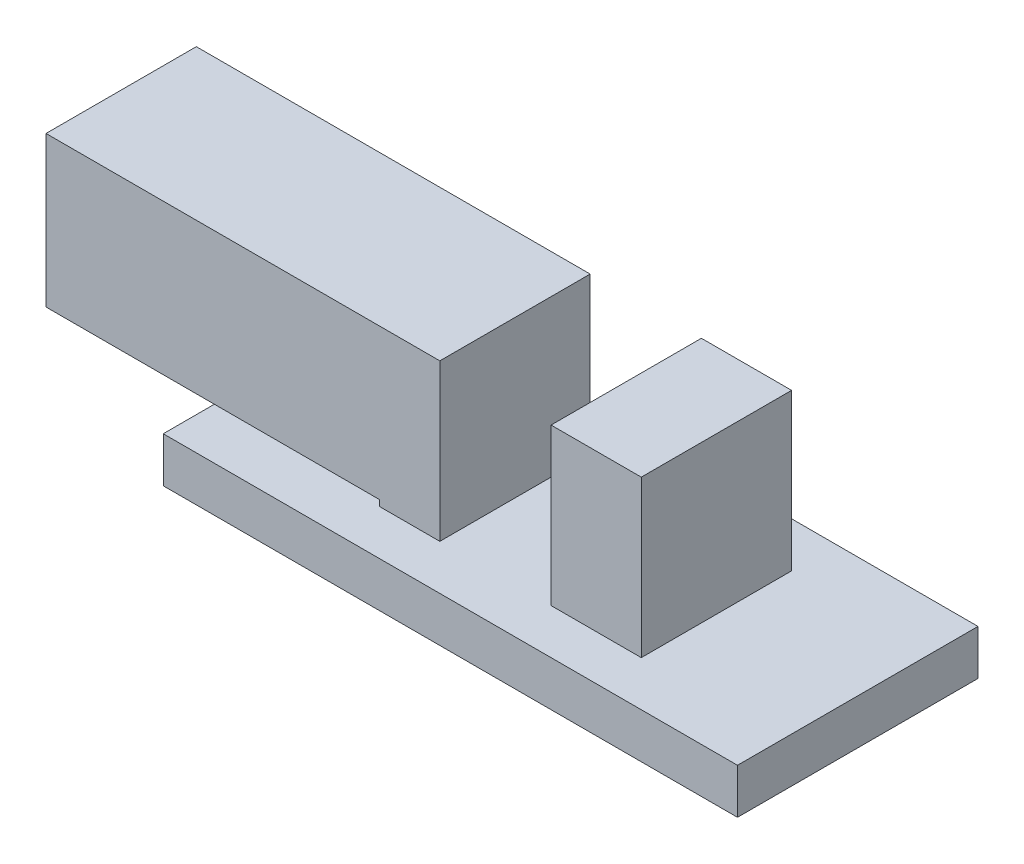
ISO-10303-21;
HEADER;
FILE_DESCRIPTION(('STEP AP214'),'2;1');
FILE_NAME('part.step','',(''),(''),'','','');
FILE_SCHEMA(('AUTOMOTIVE_DESIGN { 1 0 10303 214 1 1 1 1 }'));
ENDSEC;
DATA;
#1=APPLICATION_CONTEXT('core data for automotive mechanical design processes');
#2=APPLICATION_PROTOCOL_DEFINITION('international standard','automotive_design',2000,#1);
#3=PRODUCT_CONTEXT('',#1,'mechanical');
#4=PRODUCT('Part','Part','',(#3));
#5=PRODUCT_RELATED_PRODUCT_CATEGORY('part','',(#4));
#6=PRODUCT_DEFINITION_FORMATION('','',#4);
#7=PRODUCT_DEFINITION_CONTEXT('part definition',#1,'design');
#8=PRODUCT_DEFINITION('design','',#6,#7);
#9=PRODUCT_DEFINITION_SHAPE('','',#8);
#10=(LENGTH_UNIT() NAMED_UNIT(*) SI_UNIT(.MILLI.,.METRE.));
#11=(NAMED_UNIT(*) PLANE_ANGLE_UNIT() SI_UNIT($,.RADIAN.));
#12=(NAMED_UNIT(*) SI_UNIT($,.STERADIAN.) SOLID_ANGLE_UNIT());
#13=UNCERTAINTY_MEASURE_WITH_UNIT(LENGTH_MEASURE(1.E-05),#10,'distance_accuracy_value','');
#14=(GEOMETRIC_REPRESENTATION_CONTEXT(3) GLOBAL_UNCERTAINTY_ASSIGNED_CONTEXT((#13)) GLOBAL_UNIT_ASSIGNED_CONTEXT((#10,
#11,#12)) REPRESENTATION_CONTEXT('',''));
#15=CARTESIAN_POINT('',(0.,0.,0.));
#16=DIRECTION('',(0.,0.,1.));
#17=DIRECTION('',(1.,0.,0.));
#18=AXIS2_PLACEMENT_3D('',#15,#16,#17);
#19=CARTESIAN_POINT('',(0.,15.,0.));
#20=DIRECTION('',(0.,1.,0.));
#21=DIRECTION('',(0.,0.,1.));
#22=AXIS2_PLACEMENT_3D('',#19,#20,#21);
#23=PLANE('',#22);
#24=DIRECTION('',(0.,0.,-1.));
#25=VECTOR('',#24,1.);
#26=CARTESIAN_POINT('',(95.5,15.,-40.));
#27=LINE('',#26,#25);
#28=CARTESIAN_POINT('',(95.5,15.,40.));
#29=VERTEX_POINT('',#28);
#30=CARTESIAN_POINT('',(95.5,15.,-40.));
#31=VERTEX_POINT('',#30);
#32=EDGE_CURVE('E222',#29,#31,#27,.T.);
#33=ORIENTED_EDGE('',*,*,#32,.T.);
#34=DIRECTION('',(-1.,0.,0.));
#35=VECTOR('',#34,1.);
#36=CARTESIAN_POINT('',(-95.5,15.,-40.));
#37=LINE('',#36,#35);
#38=CARTESIAN_POINT('',(-95.5,15.,-40.));
#39=VERTEX_POINT('',#38);
#40=EDGE_CURVE('E225',#31,#39,#37,.T.);
#41=ORIENTED_EDGE('',*,*,#40,.T.);
#42=DIRECTION('',(0.,0.,1.));
#43=VECTOR('',#42,1.);
#44=CARTESIAN_POINT('',(-95.5,15.,-40.));
#45=LINE('',#44,#43);
#46=CARTESIAN_POINT('',(-95.5,15.,40.));
#47=VERTEX_POINT('',#46);
#48=EDGE_CURVE('E228',#39,#47,#45,.T.);
#49=ORIENTED_EDGE('',*,*,#48,.T.);
#50=DIRECTION('',(1.,0.,0.));
#51=VECTOR('',#50,1.);
#52=CARTESIAN_POINT('',(-95.5,15.,40.));
#53=LINE('',#52,#51);
#54=EDGE_CURVE('E230',#47,#29,#53,.T.);
#55=ORIENTED_EDGE('',*,*,#54,.T.);
#56=EDGE_LOOP('',(#33,#41,#49,#55));
#57=FACE_BOUND('',#56,.T.);
#58=DIRECTION('',(-1.,0.,0.));
#59=VECTOR('',#58,1.);
#60=CARTESIAN_POINT('',(-38.5,15.,-25.));
#61=LINE('',#60,#59);
#62=CARTESIAN_POINT('',(-18.5,15.,-25.));
#63=VERTEX_POINT('',#62);
#64=CARTESIAN_POINT('',(-38.5,15.,-25.));
#65=VERTEX_POINT('',#64);
#66=EDGE_CURVE('E208',#63,#65,#61,.T.);
#67=ORIENTED_EDGE('',*,*,#66,.F.);
#68=DIRECTION('',(0.,0.,-1.));
#69=VECTOR('',#68,1.);
#70=CARTESIAN_POINT('',(-18.5,15.,-25.));
#71=LINE('',#70,#69);
#72=CARTESIAN_POINT('',(-18.5,15.,25.));
#73=VERTEX_POINT('',#72);
#74=EDGE_CURVE('E190',#73,#63,#71,.T.);
#75=ORIENTED_EDGE('',*,*,#74,.F.);
#76=DIRECTION('',(1.,0.,0.));
#77=VECTOR('',#76,1.);
#78=CARTESIAN_POINT('',(-38.5,15.,25.));
#79=LINE('',#78,#77);
#80=CARTESIAN_POINT('',(-38.5,15.,25.));
#81=VERTEX_POINT('',#80);
#82=EDGE_CURVE('E202',#81,#73,#79,.T.);
#83=ORIENTED_EDGE('',*,*,#82,.F.);
#84=DIRECTION('',(0.,0.,1.));
#85=VECTOR('',#84,1.);
#86=CARTESIAN_POINT('',(-38.5,15.,-25.));
#87=LINE('',#86,#85);
#88=EDGE_CURVE('E211',#65,#81,#87,.T.);
#89=ORIENTED_EDGE('',*,*,#88,.F.);
#90=EDGE_LOOP('',(#67,#75,#83,#89));
#91=FACE_BOUND('',#90,.T.);
#92=DIRECTION('',(-1.,0.,0.));
#93=VECTOR('',#92,1.);
#94=CARTESIAN_POINT('',(18.5,15.,-25.));
#95=LINE('',#94,#93);
#96=CARTESIAN_POINT('',(48.5,15.,-25.));
#97=VERTEX_POINT('',#96);
#98=CARTESIAN_POINT('',(18.5,15.,-25.));
#99=VERTEX_POINT('',#98);
#100=EDGE_CURVE('E185',#97,#99,#95,.T.);
#101=ORIENTED_EDGE('',*,*,#100,.F.);
#102=DIRECTION('',(0.,0.,-1.));
#103=VECTOR('',#102,1.);
#104=CARTESIAN_POINT('',(48.5,15.,-25.));
#105=LINE('',#104,#103);
#106=CARTESIAN_POINT('',(48.5,15.,25.));
#107=VERTEX_POINT('',#106);
#108=EDGE_CURVE('E187',#107,#97,#105,.T.);
#109=ORIENTED_EDGE('',*,*,#108,.F.);
#110=DIRECTION('',(1.,0.,0.));
#111=VECTOR('',#110,1.);
#112=CARTESIAN_POINT('',(18.5,15.,25.));
#113=LINE('',#112,#111);
#114=CARTESIAN_POINT('',(18.5,15.,25.));
#115=VERTEX_POINT('',#114);
#116=EDGE_CURVE('E180',#115,#107,#113,.T.);
#117=ORIENTED_EDGE('',*,*,#116,.F.);
#118=DIRECTION('',(0.,0.,1.));
#119=VECTOR('',#118,1.);
#120=CARTESIAN_POINT('',(18.5,15.,-25.));
#121=LINE('',#120,#119);
#122=EDGE_CURVE('E182',#99,#115,#121,.T.);
#123=ORIENTED_EDGE('',*,*,#122,.F.);
#124=EDGE_LOOP('',(#101,#109,#117,#123));
#125=FACE_BOUND('',#124,.T.);
#126=ADVANCED_FACE('F39',(#57,#91,#125),#23,.T.);
#127=CARTESIAN_POINT('',(95.5,15.,-40.));
#128=DIRECTION('',(-1.,0.,0.));
#129=DIRECTION('',(0.,0.,1.));
#130=AXIS2_PLACEMENT_3D('',#127,#128,#129);
#131=PLANE('',#130);
#132=DIRECTION('',(0.,0.,-1.));
#133=VECTOR('',#132,1.);
#134=CARTESIAN_POINT('',(95.5,0.,-40.));
#135=LINE('',#134,#133);
#136=CARTESIAN_POINT('',(95.5,0.,40.));
#137=VERTEX_POINT('',#136);
#138=CARTESIAN_POINT('',(95.5,0.,-40.));
#139=VERTEX_POINT('',#138);
#140=EDGE_CURVE('E221',#137,#139,#135,.T.);
#141=ORIENTED_EDGE('',*,*,#140,.T.);
#142=DIRECTION('',(0.,-1.,0.));
#143=VECTOR('',#142,1.);
#144=CARTESIAN_POINT('',(95.5,15.,-40.));
#145=LINE('',#144,#143);
#146=EDGE_CURVE('E11',#31,#139,#145,.T.);
#147=ORIENTED_EDGE('',*,*,#146,.F.);
#148=ORIENTED_EDGE('',*,*,#32,.F.);
#149=DIRECTION('',(0.,-1.,0.));
#150=VECTOR('',#149,1.);
#151=CARTESIAN_POINT('',(95.5,15.,40.));
#152=LINE('',#151,#150);
#153=EDGE_CURVE('E232',#29,#137,#152,.T.);
#154=ORIENTED_EDGE('',*,*,#153,.T.);
#155=EDGE_LOOP('',(#141,#147,#148,#154));
#156=FACE_BOUND('',#155,.T.);
#157=ADVANCED_FACE('F41',(#156),#131,.F.);
#158=CARTESIAN_POINT('',(-95.5,15.,-40.));
#159=DIRECTION('',(0.,0.,1.));
#160=DIRECTION('',(1.,0.,0.));
#161=AXIS2_PLACEMENT_3D('',#158,#159,#160);
#162=PLANE('',#161);
#163=DIRECTION('',(-1.,0.,0.));
#164=VECTOR('',#163,1.);
#165=CARTESIAN_POINT('',(-95.5,0.,-40.));
#166=LINE('',#165,#164);
#167=CARTESIAN_POINT('',(-95.5,0.,-40.));
#168=VERTEX_POINT('',#167);
#169=EDGE_CURVE('E235',#139,#168,#166,.T.);
#170=ORIENTED_EDGE('',*,*,#169,.T.);
#171=DIRECTION('',(0.,-1.,0.));
#172=VECTOR('',#171,1.);
#173=CARTESIAN_POINT('',(-95.5,15.,-40.));
#174=LINE('',#173,#172);
#175=EDGE_CURVE('E47',#39,#168,#174,.T.);
#176=ORIENTED_EDGE('',*,*,#175,.F.);
#177=ORIENTED_EDGE('',*,*,#40,.F.);
#178=ORIENTED_EDGE('',*,*,#146,.T.);
#179=EDGE_LOOP('',(#170,#176,#177,#178));
#180=FACE_BOUND('',#179,.T.);
#181=ADVANCED_FACE('F265',(#180),#162,.F.);
#182=CARTESIAN_POINT('',(-95.5,15.,-40.));
#183=DIRECTION('',(1.,0.,0.));
#184=DIRECTION('',(0.,0.,-1.));
#185=AXIS2_PLACEMENT_3D('',#182,#183,#184);
#186=PLANE('',#185);
#187=DIRECTION('',(0.,0.,1.));
#188=VECTOR('',#187,1.);
#189=CARTESIAN_POINT('',(-95.5,0.,-40.));
#190=LINE('',#189,#188);
#191=CARTESIAN_POINT('',(-95.5,0.,40.));
#192=VERTEX_POINT('',#191);
#193=EDGE_CURVE('E237',#168,#192,#190,.T.);
#194=ORIENTED_EDGE('',*,*,#193,.T.);
#195=DIRECTION('',(0.,-1.,0.));
#196=VECTOR('',#195,1.);
#197=CARTESIAN_POINT('',(-95.5,15.,40.));
#198=LINE('',#197,#196);
#199=EDGE_CURVE('E242',#47,#192,#198,.T.);
#200=ORIENTED_EDGE('',*,*,#199,.F.);
#201=ORIENTED_EDGE('',*,*,#48,.F.);
#202=ORIENTED_EDGE('',*,*,#175,.T.);
#203=EDGE_LOOP('',(#194,#200,#201,#202));
#204=FACE_BOUND('',#203,.T.);
#205=ADVANCED_FACE('F249',(#204),#186,.F.);
#206=CARTESIAN_POINT('',(-95.5,15.,40.));
#207=DIRECTION('',(0.,0.,-1.));
#208=DIRECTION('',(-1.,0.,0.));
#209=AXIS2_PLACEMENT_3D('',#206,#207,#208);
#210=PLANE('',#209);
#211=DIRECTION('',(1.,0.,0.));
#212=VECTOR('',#211,1.);
#213=CARTESIAN_POINT('',(-95.5,0.,40.));
#214=LINE('',#213,#212);
#215=EDGE_CURVE('E226',#192,#137,#214,.T.);
#216=ORIENTED_EDGE('',*,*,#215,.T.);
#217=ORIENTED_EDGE('',*,*,#153,.F.);
#218=ORIENTED_EDGE('',*,*,#54,.F.);
#219=ORIENTED_EDGE('',*,*,#199,.T.);
#220=EDGE_LOOP('',(#216,#217,#218,#219));
#221=FACE_BOUND('',#220,.T.);
#222=ADVANCED_FACE('F258',(#221),#210,.F.);
#223=CARTESIAN_POINT('',(0.,0.,0.));
#224=DIRECTION('',(0.,1.,0.));
#225=DIRECTION('',(0.,0.,1.));
#226=AXIS2_PLACEMENT_3D('',#223,#224,#225);
#227=PLANE('',#226);
#228=ORIENTED_EDGE('',*,*,#140,.F.);
#229=ORIENTED_EDGE('',*,*,#215,.F.);
#230=ORIENTED_EDGE('',*,*,#193,.F.);
#231=ORIENTED_EDGE('',*,*,#169,.F.);
#232=EDGE_LOOP('',(#228,#229,#230,#231));
#233=FACE_BOUND('',#232,.T.);
#234=ADVANCED_FACE('F255',(#233),#227,.F.);
#235=CARTESIAN_POINT('',(-18.5,67.,-25.));
#236=DIRECTION('',(-1.,0.,0.));
#237=DIRECTION('',(0.,0.,1.));
#238=AXIS2_PLACEMENT_3D('',#235,#236,#237);
#239=PLANE('',#238);
#240=ORIENTED_EDGE('',*,*,#74,.T.);
#241=DIRECTION('',(0.,-1.,0.));
#242=VECTOR('',#241,1.);
#243=CARTESIAN_POINT('',(-18.5,67.,-25.));
#244=LINE('',#243,#242);
#245=CARTESIAN_POINT('',(-18.5,67.,-25.));
#246=VERTEX_POINT('',#245);
#247=EDGE_CURVE('E219',#246,#63,#244,.T.);
#248=ORIENTED_EDGE('',*,*,#247,.F.);
#249=DIRECTION('',(0.,0.,-1.));
#250=VECTOR('',#249,1.);
#251=CARTESIAN_POINT('',(-18.5,67.,-25.));
#252=LINE('',#251,#250);
#253=CARTESIAN_POINT('',(-18.5,67.,25.));
#254=VERTEX_POINT('',#253);
#255=EDGE_CURVE('E198',#254,#246,#252,.T.);
#256=ORIENTED_EDGE('',*,*,#255,.F.);
#257=DIRECTION('',(0.,-1.,0.));
#258=VECTOR('',#257,1.);
#259=CARTESIAN_POINT('',(-18.5,67.,25.));
#260=LINE('',#259,#258);
#261=EDGE_CURVE('E205',#254,#73,#260,.T.);
#262=ORIENTED_EDGE('',*,*,#261,.T.);
#263=EDGE_LOOP('',(#240,#248,#256,#262));
#264=FACE_BOUND('',#263,.T.);
#265=ADVANCED_FACE('F280',(#264),#239,.F.);
#266=CARTESIAN_POINT('',(-38.5,67.,-25.));
#267=DIRECTION('',(0.,0.,1.));
#268=DIRECTION('',(1.,0.,0.));
#269=AXIS2_PLACEMENT_3D('',#266,#267,#268);
#270=PLANE('',#269);
#271=ORIENTED_EDGE('',*,*,#66,.T.);
#272=DIRECTION('',(0.,-1.,0.));
#273=VECTOR('',#272,1.);
#274=CARTESIAN_POINT('',(-38.5,67.,-25.));
#275=LINE('',#274,#273);
#276=CARTESIAN_POINT('',(-38.5,17.,-25.));
#277=VERTEX_POINT('',#276);
#278=EDGE_CURVE('E217',#277,#65,#275,.T.);
#279=ORIENTED_EDGE('',*,*,#278,.F.);
#280=DIRECTION('',(1.,0.,0.));
#281=VECTOR('',#280,1.);
#282=CARTESIAN_POINT('',(-149.5,17.,-25.));
#283=LINE('',#282,#281);
#284=CARTESIAN_POINT('',(-149.5,17.,-25.));
#285=VERTEX_POINT('',#284);
#286=EDGE_CURVE('E148',#285,#277,#283,.T.);
#287=ORIENTED_EDGE('',*,*,#286,.F.);
#288=DIRECTION('',(0.,1.,0.));
#289=VECTOR('',#288,1.);
#290=CARTESIAN_POINT('',(-149.5,67.,-25.));
#291=LINE('',#290,#289);
#292=CARTESIAN_POINT('',(-149.5,67.,-25.));
#293=VERTEX_POINT('',#292);
#294=EDGE_CURVE('E159',#285,#293,#291,.T.);
#295=ORIENTED_EDGE('',*,*,#294,.T.);
#296=DIRECTION('',(-1.,0.,0.));
#297=VECTOR('',#296,1.);
#298=CARTESIAN_POINT('',(-38.5,67.,-25.));
#299=LINE('',#298,#297);
#300=EDGE_CURVE('E201',#246,#293,#299,.T.);
#301=ORIENTED_EDGE('',*,*,#300,.F.);
#302=ORIENTED_EDGE('',*,*,#247,.T.);
#303=EDGE_LOOP('',(#271,#279,#287,#295,#301,#302));
#304=FACE_BOUND('',#303,.T.);
#305=ADVANCED_FACE('F306',(#304),#270,.F.);
#306=CARTESIAN_POINT('',(-38.5,67.,-25.));
#307=DIRECTION('',(1.,0.,0.));
#308=DIRECTION('',(0.,0.,-1.));
#309=AXIS2_PLACEMENT_3D('',#306,#307,#308);
#310=PLANE('',#309);
#311=DIRECTION('',(0.,-1.,0.));
#312=VECTOR('',#311,1.);
#313=CARTESIAN_POINT('',(-38.5,67.,25.));
#314=LINE('',#313,#312);
#315=CARTESIAN_POINT('',(-38.5,17.,25.));
#316=VERTEX_POINT('',#315);
#317=EDGE_CURVE('E62',#316,#81,#314,.T.);
#318=ORIENTED_EDGE('',*,*,#317,.F.);
#319=DIRECTION('',(0.,0.,-1.));
#320=VECTOR('',#319,1.);
#321=CARTESIAN_POINT('',(-38.5,17.,25.));
#322=LINE('',#321,#320);
#323=EDGE_CURVE('E146',#316,#277,#322,.T.);
#324=ORIENTED_EDGE('',*,*,#323,.T.);
#325=ORIENTED_EDGE('',*,*,#278,.T.);
#326=ORIENTED_EDGE('',*,*,#88,.T.);
#327=EDGE_LOOP('',(#318,#324,#325,#326));
#328=FACE_BOUND('',#327,.T.);
#329=ADVANCED_FACE('F317',(#328),#310,.F.);
#330=CARTESIAN_POINT('',(-38.5,67.,25.));
#331=DIRECTION('',(0.,0.,-1.));
#332=DIRECTION('',(-1.,0.,0.));
#333=AXIS2_PLACEMENT_3D('',#330,#331,#332);
#334=PLANE('',#333);
#335=ORIENTED_EDGE('',*,*,#82,.T.);
#336=ORIENTED_EDGE('',*,*,#261,.F.);
#337=DIRECTION('',(1.,0.,0.));
#338=VECTOR('',#337,1.);
#339=CARTESIAN_POINT('',(-38.5,67.,25.));
#340=LINE('',#339,#338);
#341=CARTESIAN_POINT('',(-149.5,67.,25.));
#342=VERTEX_POINT('',#341);
#343=EDGE_CURVE('E163',#342,#254,#340,.T.);
#344=ORIENTED_EDGE('',*,*,#343,.F.);
#345=DIRECTION('',(0.,-1.,0.));
#346=VECTOR('',#345,1.);
#347=CARTESIAN_POINT('',(-149.5,67.,25.));
#348=LINE('',#347,#346);
#349=CARTESIAN_POINT('',(-149.5,17.,25.));
#350=VERTEX_POINT('',#349);
#351=EDGE_CURVE('E156',#342,#350,#348,.T.);
#352=ORIENTED_EDGE('',*,*,#351,.T.);
#353=DIRECTION('',(1.,0.,0.));
#354=VECTOR('',#353,1.);
#355=CARTESIAN_POINT('',(-149.5,17.,25.));
#356=LINE('',#355,#354);
#357=EDGE_CURVE('E141',#350,#316,#356,.T.);
#358=ORIENTED_EDGE('',*,*,#357,.T.);
#359=ORIENTED_EDGE('',*,*,#317,.T.);
#360=EDGE_LOOP('',(#335,#336,#344,#352,#358,#359));
#361=FACE_BOUND('',#360,.T.);
#362=ADVANCED_FACE('F161',(#361),#334,.F.);
#363=CARTESIAN_POINT('',(0.,67.,0.));
#364=DIRECTION('',(0.,1.,0.));
#365=DIRECTION('',(0.,0.,1.));
#366=AXIS2_PLACEMENT_3D('',#363,#364,#365);
#367=PLANE('',#366);
#368=ORIENTED_EDGE('',*,*,#255,.T.);
#369=ORIENTED_EDGE('',*,*,#300,.T.);
#370=DIRECTION('',(0.,0.,1.));
#371=VECTOR('',#370,1.);
#372=CARTESIAN_POINT('',(-149.5,67.,25.));
#373=LINE('',#372,#371);
#374=EDGE_CURVE('E149',#293,#342,#373,.T.);
#375=ORIENTED_EDGE('',*,*,#374,.T.);
#376=ORIENTED_EDGE('',*,*,#343,.T.);
#377=EDGE_LOOP('',(#368,#369,#375,#376));
#378=FACE_BOUND('',#377,.T.);
#379=ADVANCED_FACE('F338',(#378),#367,.T.);
#380=CARTESIAN_POINT('',(48.5,67.,-25.));
#381=DIRECTION('',(-1.,0.,0.));
#382=DIRECTION('',(0.,0.,1.));
#383=AXIS2_PLACEMENT_3D('',#380,#381,#382);
#384=PLANE('',#383);
#385=ORIENTED_EDGE('',*,*,#108,.T.);
#386=DIRECTION('',(0.,-1.,0.));
#387=VECTOR('',#386,1.);
#388=CARTESIAN_POINT('',(48.5,67.,-25.));
#389=LINE('',#388,#387);
#390=CARTESIAN_POINT('',(48.5,67.,-25.));
#391=VERTEX_POINT('',#390);
#392=EDGE_CURVE('E169',#391,#97,#389,.T.);
#393=ORIENTED_EDGE('',*,*,#392,.F.);
#394=DIRECTION('',(0.,0.,-1.));
#395=VECTOR('',#394,1.);
#396=CARTESIAN_POINT('',(48.5,67.,-25.));
#397=LINE('',#396,#395);
#398=CARTESIAN_POINT('',(48.5,67.,25.));
#399=VERTEX_POINT('',#398);
#400=EDGE_CURVE('E183',#399,#391,#397,.T.);
#401=ORIENTED_EDGE('',*,*,#400,.F.);
#402=DIRECTION('',(0.,-1.,0.));
#403=VECTOR('',#402,1.);
#404=CARTESIAN_POINT('',(48.5,67.,25.));
#405=LINE('',#404,#403);
#406=EDGE_CURVE('E176',#399,#107,#405,.T.);
#407=ORIENTED_EDGE('',*,*,#406,.T.);
#408=EDGE_LOOP('',(#385,#393,#401,#407));
#409=FACE_BOUND('',#408,.T.);
#410=ADVANCED_FACE('F349',(#409),#384,.F.);
#411=CARTESIAN_POINT('',(18.5,67.,-25.));
#412=DIRECTION('',(0.,0.,1.));
#413=DIRECTION('',(1.,0.,0.));
#414=AXIS2_PLACEMENT_3D('',#411,#412,#413);
#415=PLANE('',#414);
#416=ORIENTED_EDGE('',*,*,#100,.T.);
#417=DIRECTION('',(0.,-1.,0.));
#418=VECTOR('',#417,1.);
#419=CARTESIAN_POINT('',(18.5,67.,-25.));
#420=LINE('',#419,#418);
#421=CARTESIAN_POINT('',(18.5,67.,-25.));
#422=VERTEX_POINT('',#421);
#423=EDGE_CURVE('E172',#422,#99,#420,.T.);
#424=ORIENTED_EDGE('',*,*,#423,.F.);
#425=DIRECTION('',(-1.,0.,0.));
#426=VECTOR('',#425,1.);
#427=CARTESIAN_POINT('',(18.5,67.,-25.));
#428=LINE('',#427,#426);
#429=EDGE_CURVE('E194',#391,#422,#428,.T.);
#430=ORIENTED_EDGE('',*,*,#429,.F.);
#431=ORIENTED_EDGE('',*,*,#392,.T.);
#432=EDGE_LOOP('',(#416,#424,#430,#431));
#433=FACE_BOUND('',#432,.T.);
#434=ADVANCED_FACE('F360',(#433),#415,.F.);
#435=CARTESIAN_POINT('',(18.5,67.,-25.));
#436=DIRECTION('',(1.,0.,0.));
#437=DIRECTION('',(0.,0.,-1.));
#438=AXIS2_PLACEMENT_3D('',#435,#436,#437);
#439=PLANE('',#438);
#440=ORIENTED_EDGE('',*,*,#122,.T.);
#441=DIRECTION('',(0.,-1.,0.));
#442=VECTOR('',#441,1.);
#443=CARTESIAN_POINT('',(18.5,67.,25.));
#444=LINE('',#443,#442);
#445=CARTESIAN_POINT('',(18.5,67.,25.));
#446=VERTEX_POINT('',#445);
#447=EDGE_CURVE('E54',#446,#115,#444,.T.);
#448=ORIENTED_EDGE('',*,*,#447,.F.);
#449=DIRECTION('',(0.,0.,1.));
#450=VECTOR('',#449,1.);
#451=CARTESIAN_POINT('',(18.5,67.,-25.));
#452=LINE('',#451,#450);
#453=EDGE_CURVE('E192',#422,#446,#452,.T.);
#454=ORIENTED_EDGE('',*,*,#453,.F.);
#455=ORIENTED_EDGE('',*,*,#423,.T.);
#456=EDGE_LOOP('',(#440,#448,#454,#455));
#457=FACE_BOUND('',#456,.T.);
#458=ADVANCED_FACE('F370',(#457),#439,.F.);
#459=CARTESIAN_POINT('',(18.5,67.,25.));
#460=DIRECTION('',(0.,0.,-1.));
#461=DIRECTION('',(-1.,0.,0.));
#462=AXIS2_PLACEMENT_3D('',#459,#460,#461);
#463=PLANE('',#462);
#464=ORIENTED_EDGE('',*,*,#116,.T.);
#465=ORIENTED_EDGE('',*,*,#406,.F.);
#466=DIRECTION('',(1.,0.,0.));
#467=VECTOR('',#466,1.);
#468=CARTESIAN_POINT('',(18.5,67.,25.));
#469=LINE('',#468,#467);
#470=EDGE_CURVE('E179',#446,#399,#469,.T.);
#471=ORIENTED_EDGE('',*,*,#470,.F.);
#472=ORIENTED_EDGE('',*,*,#447,.T.);
#473=EDGE_LOOP('',(#464,#465,#471,#472));
#474=FACE_BOUND('',#473,.T.);
#475=ADVANCED_FACE('F380',(#474),#463,.F.);
#476=CARTESIAN_POINT('',(0.,67.,0.));
#477=DIRECTION('',(0.,1.,0.));
#478=DIRECTION('',(0.,0.,1.));
#479=AXIS2_PLACEMENT_3D('',#476,#477,#478);
#480=PLANE('',#479);
#481=ORIENTED_EDGE('',*,*,#400,.T.);
#482=ORIENTED_EDGE('',*,*,#429,.T.);
#483=ORIENTED_EDGE('',*,*,#453,.T.);
#484=ORIENTED_EDGE('',*,*,#470,.T.);
#485=EDGE_LOOP('',(#481,#482,#483,#484));
#486=FACE_BOUND('',#485,.T.);
#487=ADVANCED_FACE('F389',(#486),#480,.T.);
#488=CARTESIAN_POINT('',(-149.5,17.,25.));
#489=DIRECTION('',(0.,-1.,0.));
#490=DIRECTION('',(0.,0.,-1.));
#491=AXIS2_PLACEMENT_3D('',#488,#489,#490);
#492=PLANE('',#491);
#493=ORIENTED_EDGE('',*,*,#323,.F.);
#494=ORIENTED_EDGE('',*,*,#357,.F.);
#495=DIRECTION('',(0.,0.,-1.));
#496=VECTOR('',#495,1.);
#497=CARTESIAN_POINT('',(-149.5,17.,25.));
#498=LINE('',#497,#496);
#499=EDGE_CURVE('E144',#350,#285,#498,.T.);
#500=ORIENTED_EDGE('',*,*,#499,.T.);
#501=ORIENTED_EDGE('',*,*,#286,.T.);
#502=EDGE_LOOP('',(#493,#494,#500,#501));
#503=FACE_BOUND('',#502,.T.);
#504=ADVANCED_FACE('F143',(#503),#492,.T.);
#505=CARTESIAN_POINT('',(-149.5,0.,0.));
#506=DIRECTION('',(1.,0.,0.));
#507=DIRECTION('',(0.,0.,-1.));
#508=AXIS2_PLACEMENT_3D('',#505,#506,#507);
#509=PLANE('',#508);
#510=ORIENTED_EDGE('',*,*,#351,.F.);
#511=ORIENTED_EDGE('',*,*,#374,.F.);
#512=ORIENTED_EDGE('',*,*,#294,.F.);
#513=ORIENTED_EDGE('',*,*,#499,.F.);
#514=EDGE_LOOP('',(#510,#511,#512,#513));
#515=FACE_BOUND('',#514,.T.);
#516=ADVANCED_FACE('F154',(#515),#509,.F.);
#517=CLOSED_SHELL('',(#126,#157,#181,#205,#222,#234,#265,#305,#329,#362,#379,#410,#434,#458,
#475,#487,#504,#516));
#518=MANIFOLD_SOLID_BREP('B2',#517);
#519=ADVANCED_BREP_SHAPE_REPRESENTATION('',(#18,#518),#14);
#520=SHAPE_DEFINITION_REPRESENTATION(#9,#519);
ENDSEC;
END-ISO-10303-21;
